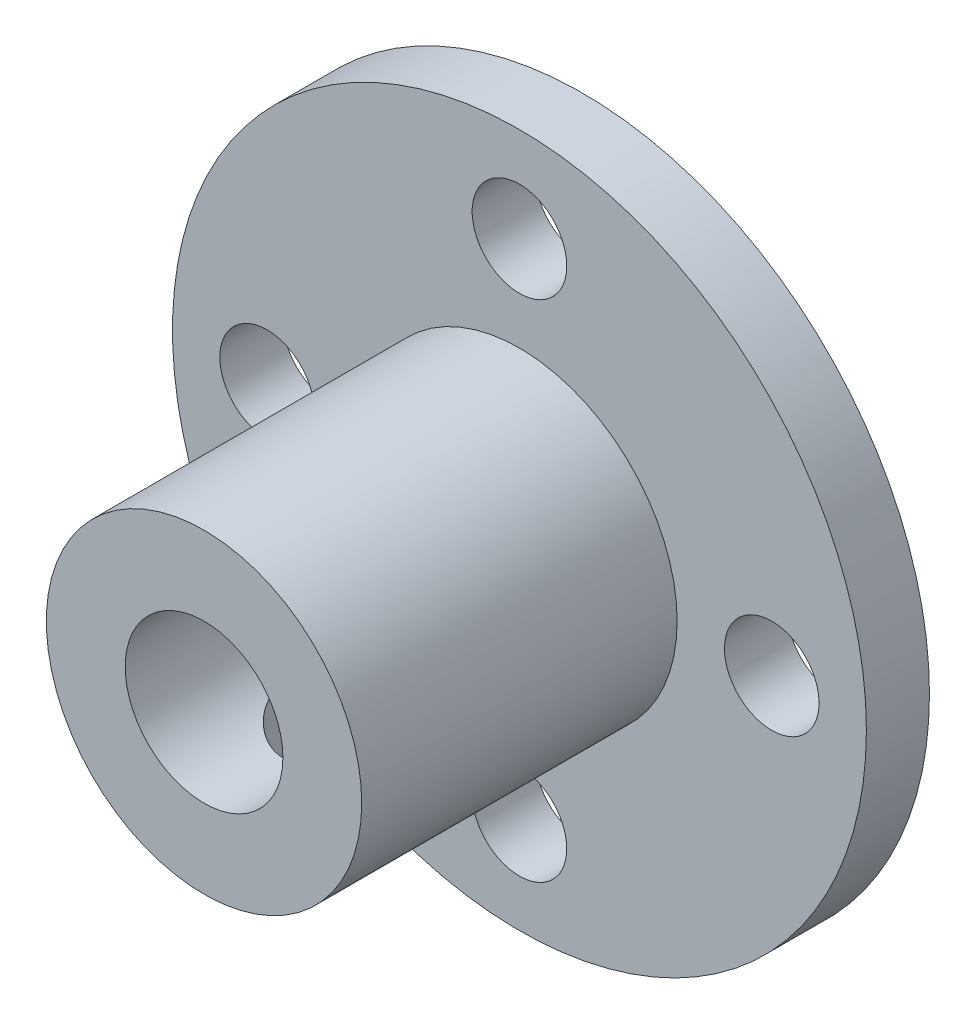
ISO-10303-21;
HEADER;
FILE_DESCRIPTION(('STEP AP214'),'2;1');
FILE_NAME('part.step','',(''),(''),'','','');
FILE_SCHEMA(('AUTOMOTIVE_DESIGN { 1 0 10303 214 1 1 1 1 }'));
ENDSEC;
DATA;
#1=APPLICATION_CONTEXT('core data for automotive mechanical design processes');
#2=APPLICATION_PROTOCOL_DEFINITION('international standard','automotive_design',2000,#1);
#3=PRODUCT_CONTEXT('',#1,'mechanical');
#4=PRODUCT('Part','Part','',(#3));
#5=PRODUCT_RELATED_PRODUCT_CATEGORY('part','',(#4));
#6=PRODUCT_DEFINITION_FORMATION('','',#4);
#7=PRODUCT_DEFINITION_CONTEXT('part definition',#1,'design');
#8=PRODUCT_DEFINITION('design','',#6,#7);
#9=PRODUCT_DEFINITION_SHAPE('','',#8);
#10=(LENGTH_UNIT() NAMED_UNIT(*) SI_UNIT(.MILLI.,.METRE.));
#11=(NAMED_UNIT(*) PLANE_ANGLE_UNIT() SI_UNIT($,.RADIAN.));
#12=(NAMED_UNIT(*) SI_UNIT($,.STERADIAN.) SOLID_ANGLE_UNIT());
#13=UNCERTAINTY_MEASURE_WITH_UNIT(LENGTH_MEASURE(1.E-05),#10,'distance_accuracy_value','');
#14=(GEOMETRIC_REPRESENTATION_CONTEXT(3) GLOBAL_UNCERTAINTY_ASSIGNED_CONTEXT((#13)) GLOBAL_UNIT_ASSIGNED_CONTEXT((#10,
#11,#12)) REPRESENTATION_CONTEXT('',''));
#15=CARTESIAN_POINT('',(0.,0.,0.));
#16=DIRECTION('',(0.,0.,1.));
#17=DIRECTION('',(1.,0.,0.));
#18=AXIS2_PLACEMENT_3D('',#15,#16,#17);
#19=CARTESIAN_POINT('',(0.,0.,2.));
#20=DIRECTION('',(0.,0.,-1.));
#21=DIRECTION('',(-1.,0.,0.));
#22=AXIS2_PLACEMENT_3D('',#19,#20,#21);
#23=CYLINDRICAL_SURFACE('',#22,10.999999971);
#24=CARTESIAN_POINT('',(0.,0.,2.));
#25=DIRECTION('',(0.,0.,1.));
#26=DIRECTION('',(1.,0.,0.));
#27=AXIS2_PLACEMENT_3D('',#24,#25,#26);
#28=CIRCLE('',#27,10.999999971);
#29=CARTESIAN_POINT('',(10.999999971,0.,2.));
#30=VERTEX_POINT('',#29);
#31=EDGE_CURVE('E50',#30,#30,#28,.T.);
#32=ORIENTED_EDGE('',*,*,#31,.F.);
#33=EDGE_LOOP('',(#32));
#34=FACE_BOUND('',#33,.T.);
#35=CARTESIAN_POINT('',(0.,0.,0.));
#36=DIRECTION('',(0.,0.,1.));
#37=DIRECTION('',(1.,0.,0.));
#38=AXIS2_PLACEMENT_3D('',#35,#36,#37);
#39=CIRCLE('',#38,10.999999971);
#40=CARTESIAN_POINT('',(10.999999971,0.,0.));
#41=VERTEX_POINT('',#40);
#42=EDGE_CURVE('E56',#41,#41,#39,.T.);
#43=ORIENTED_EDGE('',*,*,#42,.T.);
#44=EDGE_LOOP('',(#43));
#45=FACE_BOUND('',#44,.T.);
#46=ADVANCED_FACE('F37',(#34,#45),#23,.T.);
#47=CARTESIAN_POINT('',(0.,0.,2.));
#48=DIRECTION('',(0.,0.,1.));
#49=DIRECTION('',(1.,0.,0.));
#50=AXIS2_PLACEMENT_3D('',#47,#48,#49);
#51=PLANE('',#50);
#52=CARTESIAN_POINT('',(-8.,0.,2.));
#53=DIRECTION('',(0.,0.,1.));
#54=DIRECTION('',(0.,1.,0.));
#55=AXIS2_PLACEMENT_3D('',#52,#53,#54);
#56=CIRCLE('',#55,1.5);
#57=CARTESIAN_POINT('',(-8.00000000000001,1.49999999999997,2.));
#58=VERTEX_POINT('',#57);
#59=EDGE_CURVE('E130',#58,#58,#56,.T.);
#60=ORIENTED_EDGE('',*,*,#59,.F.);
#61=EDGE_LOOP('',(#60));
#62=FACE_BOUND('',#61,.T.);
#63=CARTESIAN_POINT('',(0.,-8.,2.));
#64=DIRECTION('',(0.,0.,1.));
#65=DIRECTION('',(-1.,0.,0.));
#66=AXIS2_PLACEMENT_3D('',#63,#64,#65);
#67=CIRCLE('',#66,1.5);
#68=CARTESIAN_POINT('',(-1.5,-8.,2.));
#69=VERTEX_POINT('',#68);
#70=EDGE_CURVE('E134',#69,#69,#67,.T.);
#71=ORIENTED_EDGE('',*,*,#70,.F.);
#72=EDGE_LOOP('',(#71));
#73=FACE_BOUND('',#72,.T.);
#74=CARTESIAN_POINT('',(8.,0.,2.));
#75=DIRECTION('',(0.,0.,1.));
#76=DIRECTION('',(0.,-1.,0.));
#77=AXIS2_PLACEMENT_3D('',#74,#75,#76);
#78=CIRCLE('',#77,1.5);
#79=CARTESIAN_POINT('',(8.00000000000002,-1.49999999999992,2.));
#80=VERTEX_POINT('',#79);
#81=EDGE_CURVE('E138',#80,#80,#78,.T.);
#82=ORIENTED_EDGE('',*,*,#81,.F.);
#83=EDGE_LOOP('',(#82));
#84=FACE_BOUND('',#83,.T.);
#85=CARTESIAN_POINT('',(0.,8.,2.));
#86=DIRECTION('',(0.,0.,1.));
#87=DIRECTION('',(1.,0.,0.));
#88=AXIS2_PLACEMENT_3D('',#85,#86,#87);
#89=CIRCLE('',#88,1.5);
#90=CARTESIAN_POINT('',(1.5,8.,2.));
#91=VERTEX_POINT('',#90);
#92=EDGE_CURVE('E87',#91,#91,#89,.T.);
#93=ORIENTED_EDGE('',*,*,#92,.F.);
#94=EDGE_LOOP('',(#93));
#95=FACE_BOUND('',#94,.T.);
#96=CARTESIAN_POINT('',(0.,0.,2.));
#97=DIRECTION('',(0.,0.,1.));
#98=DIRECTION('',(1.,0.,0.));
#99=AXIS2_PLACEMENT_3D('',#96,#97,#98);
#100=CIRCLE('',#99,5.);
#101=CARTESIAN_POINT('',(5.,0.,2.));
#102=VERTEX_POINT('',#101);
#103=EDGE_CURVE('E10',#102,#102,#100,.T.);
#104=ORIENTED_EDGE('',*,*,#103,.F.);
#105=EDGE_LOOP('',(#104));
#106=FACE_BOUND('',#105,.T.);
#107=ORIENTED_EDGE('',*,*,#31,.T.);
#108=EDGE_LOOP('',(#107));
#109=FACE_BOUND('',#108,.T.);
#110=ADVANCED_FACE('F115',(#62,#73,#84,#95,#106,#109),#51,.T.);
#111=CARTESIAN_POINT('',(0.,0.,0.));
#112=DIRECTION('',(0.,0.,1.));
#113=DIRECTION('',(1.,0.,0.));
#114=AXIS2_PLACEMENT_3D('',#111,#112,#113);
#115=PLANE('',#114);
#116=CARTESIAN_POINT('',(-8.,0.,0.));
#117=DIRECTION('',(0.,0.,1.));
#118=DIRECTION('',(0.,1.,0.));
#119=AXIS2_PLACEMENT_3D('',#116,#117,#118);
#120=CIRCLE('',#119,1.5);
#121=CARTESIAN_POINT('',(-8.00000000000001,1.49999999999997,0.));
#122=VERTEX_POINT('',#121);
#123=EDGE_CURVE('E145',#122,#122,#120,.T.);
#124=ORIENTED_EDGE('',*,*,#123,.T.);
#125=EDGE_LOOP('',(#124));
#126=FACE_BOUND('',#125,.T.);
#127=CARTESIAN_POINT('',(0.,-8.,0.));
#128=DIRECTION('',(0.,0.,1.));
#129=DIRECTION('',(-1.,0.,0.));
#130=AXIS2_PLACEMENT_3D('',#127,#128,#129);
#131=CIRCLE('',#130,1.5);
#132=CARTESIAN_POINT('',(-1.5,-8.,0.));
#133=VERTEX_POINT('',#132);
#134=EDGE_CURVE('E153',#133,#133,#131,.T.);
#135=ORIENTED_EDGE('',*,*,#134,.T.);
#136=EDGE_LOOP('',(#135));
#137=FACE_BOUND('',#136,.T.);
#138=CARTESIAN_POINT('',(8.,0.,0.));
#139=DIRECTION('',(0.,0.,1.));
#140=DIRECTION('',(0.,-1.,0.));
#141=AXIS2_PLACEMENT_3D('',#138,#139,#140);
#142=CIRCLE('',#141,1.5);
#143=CARTESIAN_POINT('',(8.00000000000002,-1.49999999999992,0.));
#144=VERTEX_POINT('',#143);
#145=EDGE_CURVE('E161',#144,#144,#142,.T.);
#146=ORIENTED_EDGE('',*,*,#145,.T.);
#147=EDGE_LOOP('',(#146));
#148=FACE_BOUND('',#147,.T.);
#149=CARTESIAN_POINT('',(0.,8.,0.));
#150=DIRECTION('',(0.,0.,1.));
#151=DIRECTION('',(1.,0.,0.));
#152=AXIS2_PLACEMENT_3D('',#149,#150,#151);
#153=CIRCLE('',#152,1.5);
#154=CARTESIAN_POINT('',(1.5,8.,0.));
#155=VERTEX_POINT('',#154);
#156=EDGE_CURVE('E144',#155,#155,#153,.T.);
#157=ORIENTED_EDGE('',*,*,#156,.T.);
#158=EDGE_LOOP('',(#157));
#159=FACE_BOUND('',#158,.T.);
#160=CARTESIAN_POINT('',(0.,0.,0.));
#161=DIRECTION('',(0.,0.,1.));
#162=DIRECTION('',(1.,0.,0.));
#163=AXIS2_PLACEMENT_3D('',#160,#161,#162);
#164=CIRCLE('',#163,2.5);
#165=CARTESIAN_POINT('',(2.5,0.,0.));
#166=VERTEX_POINT('',#165);
#167=EDGE_CURVE('E67',#166,#166,#164,.T.);
#168=ORIENTED_EDGE('',*,*,#167,.T.);
#169=EDGE_LOOP('',(#168));
#170=FACE_BOUND('',#169,.T.);
#171=ORIENTED_EDGE('',*,*,#42,.F.);
#172=EDGE_LOOP('',(#171));
#173=FACE_BOUND('',#172,.T.);
#174=ADVANCED_FACE('F111',(#126,#137,#148,#159,#170,#173),#115,.F.);
#175=CARTESIAN_POINT('',(0.,0.,12.));
#176=DIRECTION('',(0.,0.,-1.));
#177=DIRECTION('',(-1.,0.,0.));
#178=AXIS2_PLACEMENT_3D('',#175,#176,#177);
#179=CYLINDRICAL_SURFACE('',#178,5.);
#180=CARTESIAN_POINT('',(0.,-5.,9.500000048));
#181=CARTESIAN_POINT('',(0.0822886152646513,-4.99999929250568,9.49999905051541));
#182=CARTESIAN_POINT('',(0.164587323371197,-4.99794915681454,9.49320618417885));
#183=CARTESIAN_POINT('',(0.326788135260431,-4.98997105532517,9.46627869280292));
#184=CARTESIAN_POINT('',(0.406689516794646,-4.98404193292377,9.44614008842198));
#185=CARTESIAN_POINT('',(0.561732724840896,-4.96895552312414,9.39325402802341));
#186=CARTESIAN_POINT('',(0.636881383757677,-4.95980300005085,9.36052517438401));
#187=CARTESIAN_POINT('',(0.780624204778959,-4.93922108865979,9.28346394876697));
#188=CARTESIAN_POINT('',(0.849217493282935,-4.92779139749987,9.23913003317771));
#189=CARTESIAN_POINT('',(0.979871827097542,-4.90350736598068,9.13877603020398));
#190=CARTESIAN_POINT('',(1.04171810315282,-4.89062382979733,9.08248341012042));
#191=CARTESIAN_POINT('',(1.15524924483818,-4.86505833367351,8.9603908024554));
#192=CARTESIAN_POINT('',(1.20693240058095,-4.85237640798219,8.89458921827003));
#193=CARTESIAN_POINT('',(1.29980041772821,-4.82834112905556,8.75352927298468));
#194=CARTESIAN_POINT('',(1.34072313216917,-4.81702405497373,8.67809156260994));
#195=CARTESIAN_POINT('',(1.40921399216941,-4.79743619090203,8.52101076427648));
#196=CARTESIAN_POINT('',(1.43678534464076,-4.78916466950431,8.43936917190667));
#197=CARTESIAN_POINT('',(1.47701638376501,-4.77690869387457,8.27460974440115));
#198=CARTESIAN_POINT('',(1.49007200979935,-4.77281067843102,8.19159726404741));
#199=CARTESIAN_POINT('',(1.5021373541843,-4.76902788236738,8.02446684639405));
#200=CARTESIAN_POINT('',(1.50115047571964,-4.76934203246384,7.94034918187147));
#201=CARTESIAN_POINT('',(1.48546981983149,-4.77424742579499,7.77661608631004));
#202=CARTESIAN_POINT('',(1.47127210016375,-4.7786838713581,7.69694774221944));
#203=CARTESIAN_POINT('',(1.43037425088823,-4.79108354837097,7.54118020172328));
#204=CARTESIAN_POINT('',(1.40367288741123,-4.79904712787684,7.46508135837433));
#205=CARTESIAN_POINT('',(1.3381603109518,-4.81772731841971,7.31739963164531));
#206=CARTESIAN_POINT('',(1.299188212792,-4.8284801494817,7.24589289516201));
#207=CARTESIAN_POINT('',(1.21035226709552,-4.85150985973182,7.11026795290897));
#208=CARTESIAN_POINT('',(1.16048577996687,-4.86378710795792,7.04615154349618));
#209=CARTESIAN_POINT('',(1.04881294457145,-4.8891101050812,6.92431377808754));
#210=CARTESIAN_POINT('',(0.986594942585505,-4.90216653606592,6.86697130280354));
#211=CARTESIAN_POINT('',(0.853263290514089,-4.92712243525804,6.76344597905515));
#212=CARTESIAN_POINT('',(0.782149080939959,-4.93902183061495,6.71726383300762));
#213=CARTESIAN_POINT('',(0.63235506282191,-4.96043159761108,6.63714003588867));
#214=CARTESIAN_POINT('',(0.553627771740589,-4.96992543427675,6.60328244074472));
#215=CARTESIAN_POINT('',(0.391245432392717,-4.98533521704775,6.54940036462757));
#216=CARTESIAN_POINT('',(0.307591765661963,-4.99125216105033,6.52937202528577));
#217=CARTESIAN_POINT('',(0.14095225144631,-4.99868364622916,6.50434777464606));
#218=CARTESIAN_POINT('',(0.0580501038112236,-5.00034850414865,6.49883836633319));
#219=CARTESIAN_POINT('',(-0.107499604783979,-4.99952923248269,6.50156910744473));
#220=CARTESIAN_POINT('',(-0.190147198254065,-4.99704565676011,6.50980742139241));
#221=CARTESIAN_POINT('',(-0.350903611830611,-4.98830696945108,6.53938456325231));
#222=CARTESIAN_POINT('',(-0.429072781495656,-4.98213829726506,6.56042334008173));
#223=CARTESIAN_POINT('',(-0.580754652459246,-4.96674347687219,6.61464318633042));
#224=CARTESIAN_POINT('',(-0.654266792792947,-4.95751696116221,6.64782571528147));
#225=CARTESIAN_POINT('',(-0.796437209731239,-4.93669654027803,6.72625312147077));
#226=CARTESIAN_POINT('',(-0.864943848700237,-4.92505280437476,6.77175929801058));
#227=CARTESIAN_POINT('',(-0.993523334743792,-4.90073468224724,6.87322471357502));
#228=CARTESIAN_POINT('',(-1.05359406115209,-4.88806003812764,6.92918657279675));
#229=CARTESIAN_POINT('',(-1.16585747835014,-4.86253171084486,7.05238727254909));
#230=CARTESIAN_POINT('',(-1.21768484713221,-4.84968824160968,7.11996184186945));
#231=CARTESIAN_POINT('',(-1.30928998915114,-4.82576514197749,7.26312790927144));
#232=CARTESIAN_POINT('',(-1.34906807835937,-4.81468546533171,7.33871919705841));
#233=CARTESIAN_POINT('',(-1.41517351422234,-4.79567188348753,7.49553246855015));
#234=CARTESIAN_POINT('',(-1.4415635135669,-4.78772336513555,7.5767261663869));
#235=CARTESIAN_POINT('',(-1.48021735437643,-4.775915929306,7.74268795410007));
#236=CARTESIAN_POINT('',(-1.49248603679678,-4.77205561038134,7.82745480871953));
#237=CARTESIAN_POINT('',(-1.50221989289019,-4.76899970982909,7.9943615115949));
#238=CARTESIAN_POINT('',(-1.50028060142943,-4.76961645922064,8.07646364675308));
#239=CARTESIAN_POINT('',(-1.48307510300776,-4.77499399780055,8.239114104153));
#240=CARTESIAN_POINT('',(-1.46780942971702,-4.77975462104273,8.31966248848445));
#241=CARTESIAN_POINT('',(-1.42476893598795,-4.79275762245195,8.47594540728262));
#242=CARTESIAN_POINT('',(-1.39715180260871,-4.80095603163032,8.55172729781214));
#243=CARTESIAN_POINT('',(-1.3303151176203,-4.81990277628716,8.69764245379016));
#244=CARTESIAN_POINT('',(-1.29109334531715,-4.83065159974152,8.76777463482443));
#245=CARTESIAN_POINT('',(-1.20048768188265,-4.8539767534289,8.90316313821599));
#246=CARTESIAN_POINT('',(-1.14871280359268,-4.86660539158555,8.96814878522276));
#247=CARTESIAN_POINT('',(-1.03517438628822,-4.89201319605568,9.08870252660736));
#248=CARTESIAN_POINT('',(-0.973408255621595,-4.90479240062533,9.14426816983083));
#249=CARTESIAN_POINT('',(-0.839465797133501,-4.92950935978267,9.24602344672238));
#250=CARTESIAN_POINT('',(-0.76703791867597,-4.94141159258809,9.29189148324812));
#251=CARTESIAN_POINT('',(-0.61514140240123,-4.96260680107148,9.37073520985262));
#252=CARTESIAN_POINT('',(-0.535676079013649,-4.97190099655077,9.40371692981326));
#253=CARTESIAN_POINT('',(-0.380757732464092,-4.98602174823477,9.45289532022835));
#254=CARTESIAN_POINT('',(-0.305786977916258,-4.99122027289313,9.4705117187373));
#255=CARTESIAN_POINT('',(-0.153880203306795,-4.99820944475635,9.49406357280748));
#256=CARTESIAN_POINT('',(-0.0769445138950142,-5.00000066154724,9.50000098070456));
#257=CARTESIAN_POINT('',(0.,-5.,9.500000048));
#258=B_SPLINE_CURVE_WITH_KNOTS('',3,(#180,#181,#182,#183,#184,#185,#186,#187,#188,#189,#190,
#191,#192,#193,#194,#195,#196,#197,#198,#199,#200,#201,#202,#203,#204,#205,#206,#207,#208,#209,
#210,#211,#212,#213,#214,#215,#216,#217,#218,#219,#220,#221,#222,#223,#224,#225,#226,#227,#228,
#229,#230,#231,#232,#233,#234,#235,#236,#237,#238,#239,#240,#241,#242,#243,#244,#245,#246,#247,
#248,#249,#250,#251,#252,#253,#254,#255,#256,#257),.UNSPECIFIED.,.T.,.F.,(4,2,2,2,2,2,2,2,2,2,2,
2,2,2,2,2,2,2,2,2,2,2,2,2,2,2,2,2,2,2,2,2,2,2,2,2,2,2,4),(0.,0.246583211131695,
0.493239979872933,0.739533698811067,0.98586019441183,1.23855606753251,1.49129441899304,
1.74971486480526,2.00807320884729,2.25919696497441,2.51025986258634,2.75226025342805,
2.99428453008922,3.23962436530433,3.48502370974767,3.74067115697028,3.99633469012841,
4.25371060222256,4.51101467727455,4.75908824410732,5.00712869295716,5.24956763141441,
5.49203571766721,5.74011323630007,5.98825300681975,6.24540419848414,6.50254864622243,
6.75847836174514,7.01432031536237,7.25950178291326,7.50467343234265,7.74680064675078,
7.98897422525519,8.23996951427785,8.49103001421146,8.74943023542082,9.0077093984344,
9.2383172138852,9.46888647616018),.UNSPECIFIED.);
#259=CARTESIAN_POINT('',(0.,-5.,9.500000048));
#260=VERTEX_POINT('',#259);
#261=EDGE_CURVE('E78',#260,#260,#258,.T.);
#262=ORIENTED_EDGE('',*,*,#261,.T.);
#263=EDGE_LOOP('',(#262));
#264=FACE_BOUND('',#263,.T.);
#265=CARTESIAN_POINT('',(0.,0.,12.));
#266=DIRECTION('',(0.,0.,1.));
#267=DIRECTION('',(1.,0.,0.));
#268=AXIS2_PLACEMENT_3D('',#265,#266,#267);
#269=CIRCLE('',#268,5.);
#270=CARTESIAN_POINT('',(5.,0.,12.));
#271=VERTEX_POINT('',#270);
#272=EDGE_CURVE('E59',#271,#271,#269,.T.);
#273=ORIENTED_EDGE('',*,*,#272,.F.);
#274=EDGE_LOOP('',(#273));
#275=FACE_BOUND('',#274,.T.);
#276=ORIENTED_EDGE('',*,*,#103,.T.);
#277=EDGE_LOOP('',(#276));
#278=FACE_BOUND('',#277,.T.);
#279=ADVANCED_FACE('F89',(#264,#275,#278),#179,.T.);
#280=CARTESIAN_POINT('',(0.,0.,12.));
#281=DIRECTION('',(0.,0.,1.));
#282=DIRECTION('',(1.,0.,0.));
#283=AXIS2_PLACEMENT_3D('',#280,#281,#282);
#284=PLANE('',#283);
#285=CARTESIAN_POINT('',(0.,0.,12.));
#286=DIRECTION('',(0.,0.,1.));
#287=DIRECTION('',(1.,0.,0.));
#288=AXIS2_PLACEMENT_3D('',#285,#286,#287);
#289=CIRCLE('',#288,2.5);
#290=CARTESIAN_POINT('',(2.5,0.,12.));
#291=VERTEX_POINT('',#290);
#292=EDGE_CURVE('E72',#291,#291,#289,.T.);
#293=ORIENTED_EDGE('',*,*,#292,.F.);
#294=EDGE_LOOP('',(#293));
#295=FACE_BOUND('',#294,.T.);
#296=ORIENTED_EDGE('',*,*,#272,.T.);
#297=EDGE_LOOP('',(#296));
#298=FACE_BOUND('',#297,.T.);
#299=ADVANCED_FACE('F104',(#295,#298),#284,.T.);
#300=CARTESIAN_POINT('',(0.,0.,0.));
#301=DIRECTION('',(0.,0.,1.));
#302=DIRECTION('',(1.,0.,0.));
#303=AXIS2_PLACEMENT_3D('',#300,#301,#302);
#304=CYLINDRICAL_SURFACE('',#303,2.5);
#305=CARTESIAN_POINT('',(0.,-2.5,9.500000048));
#306=CARTESIAN_POINT('',(-0.0767298355240368,-2.49999625789592,9.49999595698864));
#307=CARTESIAN_POINT('',(-0.153582324747805,-2.49642904595925,9.49407137694572));
#308=CARTESIAN_POINT('',(-0.30497551762311,-2.48249903515327,9.47067572786782));
#309=CARTESIAN_POINT('',(-0.379510044636526,-2.47211947884453,9.45317618517072));
#310=CARTESIAN_POINT('',(-0.523751841584813,-2.44561557764976,9.40761368495424));
#311=CARTESIAN_POINT('',(-0.593481043826685,-2.4295197289737,9.37960308741332));
#312=CARTESIAN_POINT('',(-0.727030337288505,-2.39295367052523,9.31413971119926));
#313=CARTESIAN_POINT('',(-0.790851890157214,-2.37248454694079,9.27668927667898));
#314=CARTESIAN_POINT('',(-0.916299303222659,-2.32705359771931,9.19022521527344));
#315=CARTESIAN_POINT('',(-0.977384046089592,-2.30186791097644,9.14054634562432));
#316=CARTESIAN_POINT('',(-1.09088273353134,-2.25030437859955,9.03253283497931));
#317=CARTESIAN_POINT('',(-1.14328538051232,-2.22392503563707,8.97418710045783));
#318=CARTESIAN_POINT('',(-1.24445000241835,-2.169110650084,8.84207652390133));
#319=CARTESIAN_POINT('',(-1.29197770059574,-2.14082015488467,8.7672982612258));
#320=CARTESIAN_POINT('',(-1.37361441811459,-2.08938298758058,8.60915345413849));
#321=CARTESIAN_POINT('',(-1.40774521545757,-2.06622799408604,8.52580112850078));
#322=CARTESIAN_POINT('',(-1.45440606134472,-2.03354626501036,8.37340357021213));
#323=CARTESIAN_POINT('',(-1.47016201738714,-2.02207879872481,8.30576402117918));
#324=CARTESIAN_POINT('',(-1.49216176974748,-2.00590304848904,8.16819630162707));
#325=CARTESIAN_POINT('',(-1.49841739261976,-2.00118636120769,8.09827108744728));
#326=CARTESIAN_POINT('',(-1.50105513636855,-1.99920918829324,7.95798851927849));
#327=CARTESIAN_POINT('',(-1.49741788313643,-2.00196333343456,7.88763058695189));
#328=CARTESIAN_POINT('',(-1.4804606550267,-2.01453257751474,7.74872123363436));
#329=CARTESIAN_POINT('',(-1.46713339698137,-2.02435298751746,7.68017121168211));
#330=CARTESIAN_POINT('',(-1.4317392707071,-2.0495318331904,7.54746976280478));
#331=CARTESIAN_POINT('',(-1.409787539179,-2.064817080664,7.48327294992027));
#332=CARTESIAN_POINT('',(-1.35795067152313,-2.09927047869352,7.35930501067165));
#333=CARTESIAN_POINT('',(-1.3280626270796,-2.11844005207574,7.29953551701892));
#334=CARTESIAN_POINT('',(-1.2551798875015,-2.16255324038953,7.17501590014317));
#335=CARTESIAN_POINT('',(-1.21080730006407,-2.18792040269902,7.11122190232758));
#336=CARTESIAN_POINT('',(-1.11291098466982,-2.23930596940815,6.99132350755158));
#337=CARTESIAN_POINT('',(-1.05937850814666,-2.26532497591194,6.93522655516204));
#338=CARTESIAN_POINT('',(-0.935811890940725,-2.31935502681495,6.82438700173774));
#339=CARTESIAN_POINT('',(-0.864517738165326,-2.34713834232954,6.77092267420071));
#340=CARTESIAN_POINT('',(-0.712276103067818,-2.39772426878247,6.67687792650859));
#341=CARTESIAN_POINT('',(-0.63133381479773,-2.42052954108342,6.63629061675017));
#342=CARTESIAN_POINT('',(-0.467197631547881,-2.4573039119575,6.57206778172234));
#343=CARTESIAN_POINT('',(-0.38446766763948,-2.47173956775222,6.54752460600446));
#344=CARTESIAN_POINT('',(-0.21504793233378,-2.49218842503926,6.51298875934774));
#345=CARTESIAN_POINT('',(-0.12836303938891,-2.4982117279225,6.50297863682713));
#346=CARTESIAN_POINT('',(0.0337145866573076,-2.50090570419066,6.49849210362829));
#347=CARTESIAN_POINT('',(0.109042448185385,-2.49873521832014,6.50209109488916));
#348=CARTESIAN_POINT('',(0.257829381917742,-2.48778712302617,6.52042580078973));
#349=CARTESIAN_POINT('',(0.331288491986099,-2.47900964758196,6.53516128959902));
#350=CARTESIAN_POINT('',(0.472574919358608,-2.45594792693812,6.57454337797866));
#351=CARTESIAN_POINT('',(0.540495740080716,-2.44180275908152,6.59894029342139));
#352=CARTESIAN_POINT('',(0.671265742209223,-2.40913881060037,6.656677319249));
#353=CARTESIAN_POINT('',(0.734113920104506,-2.39061916741331,6.69001919358429));
#354=CARTESIAN_POINT('',(0.860006262176033,-2.34845496267813,6.76855692019415));
#355=CARTESIAN_POINT('',(0.922394152013867,-2.32447802684839,6.81462376946289));
#356=CARTESIAN_POINT('',(1.03902603734523,-2.27474265305993,6.91539133279113));
#357=CARTESIAN_POINT('',(1.09326041104589,-2.24898216189369,6.97010209367402));
#358=CARTESIAN_POINT('',(1.19931998124082,-2.19445423161978,7.09491032866678));
#359=CARTESIAN_POINT('',(1.24991021339262,-2.1657324077007,7.1660838245065));
#360=CARTESIAN_POINT('',(1.33845241264063,-2.11216180588378,7.31721596487264));
#361=CARTESIAN_POINT('',(1.37641769438081,-2.08730896245695,7.39716523505097));
#362=CARTESIAN_POINT('',(1.43142582040252,-2.04984906979737,7.54624296569639));
#363=CARTESIAN_POINT('',(1.45121628835121,-2.03575656837474,7.61398025700664));
#364=CARTESIAN_POINT('',(1.48113667902829,-2.01409602807367,7.75253202577876));
#365=CARTESIAN_POINT('',(1.49127999538126,-2.00651894491971,7.82334209381747));
#366=CARTESIAN_POINT('',(1.50134135119808,-1.99900443084989,7.96637690133313));
#367=CARTESIAN_POINT('',(1.50122094028624,-1.99909572749912,8.03860594688225));
#368=CARTESIAN_POINT('',(1.49066478271207,-2.00697713946759,8.18189439710728));
#369=CARTESIAN_POINT('',(1.48022342701269,-2.01477144107373,8.25295314442225));
#370=CARTESIAN_POINT('',(1.45040179962319,-2.03633181100649,8.38848838600195));
#371=CARTESIAN_POINT('',(1.43147642836367,-2.04979207619614,8.45311706404529));
#372=CARTESIAN_POINT('',(1.38563248421773,-2.0810549773349,8.57833722703785));
#373=CARTESIAN_POINT('',(1.35871090109406,-2.09885924816781,8.63892718104077));
#374=CARTESIAN_POINT('',(1.29289252466712,-2.14012986372549,8.76431983456593));
#375=CARTESIAN_POINT('',(1.25279174803604,-2.16404583452557,8.82834108299885));
#376=CARTESIAN_POINT('',(1.16375705956257,-2.21320123048162,8.94938005572084));
#377=CARTESIAN_POINT('',(1.11481587397405,-2.23844173321652,9.00639194741586));
#378=CARTESIAN_POINT('',(1.00009785554834,-2.29225686744329,9.12135094100757));
#379=CARTESIAN_POINT('',(0.932876901521191,-2.32070305360159,9.17793107106683));
#380=CARTESIAN_POINT('',(0.788462517859709,-2.37365426102816,9.27909786087676));
#381=CARTESIAN_POINT('',(0.711265528204316,-2.39815786831633,9.32368022154438));
#382=CARTESIAN_POINT('',(0.5511253124557,-2.43985576818916,9.39778582713439));
#383=CARTESIAN_POINT('',(0.468430166128387,-2.45725075983136,9.42772808964424));
#384=CARTESIAN_POINT('',(0.297973379109731,-2.48366272137654,9.47272472958174));
#385=CARTESIAN_POINT('',(0.210232168946209,-2.49271125302173,9.48783520672475));
#386=CARTESIAN_POINT('',(0.10155815123691,-2.49802000956241,9.49669749927761));
#387=CARTESIAN_POINT('',(0.0812763025287929,-2.49876114523712,9.49793446315974));
#388=CARTESIAN_POINT('',(0.0406658424773323,-2.49975164490735,9.49958629394053));
#389=CARTESIAN_POINT('',(0.0203372295363485,-2.50000099184404,9.50000113232185));
#390=CARTESIAN_POINT('',(0.,-2.5,9.500000048));
#391=B_SPLINE_CURVE_WITH_KNOTS('',3,(#305,#306,#307,#308,#309,#310,#311,#312,#313,#314,#315,
#316,#317,#318,#319,#320,#321,#322,#323,#324,#325,#326,#327,#328,#329,#330,#331,#332,#333,#334,
#335,#336,#337,#338,#339,#340,#341,#342,#343,#344,#345,#346,#347,#348,#349,#350,#351,#352,#353,
#354,#355,#356,#357,#358,#359,#360,#361,#362,#363,#364,#365,#366,#367,#368,#369,#370,#371,#372,
#373,#374,#375,#376,#377,#378,#379,#380,#381,#382,#383,#384,#385,#386,#387,#388,#389,#390),
.UNSPECIFIED.,.T.,.F.,(4,2,2,2,2,2,2,2,2,2,2,2,2,2,2,2,2,2,2,2,2,2,2,2,2,2,2,2,2,2,2,2,2,2,2,2,
2,2,2,2,2,2,4),(0.,0.230102243689637,0.460772639723546,0.690308902834054,0.919788222280092,
1.1668159387493,1.41416261793083,1.69183818090164,1.96906046631138,2.17933836203927,
2.38935427671,2.59978178041578,2.81036760862335,3.01823275449117,3.22617417933096,
3.47047003860997,3.71500053954163,3.99360968072858,4.2720695050303,4.53296803050406,
4.79355300392788,5.01875616910843,5.24395476765034,5.46367801051937,5.6834446148129,
5.92601382121821,6.1688670686667,6.44336780050886,6.71757811083037,6.93257806481605,
7.14727908596192,7.36278446367448,7.57840702471014,7.78364119842077,7.98895273229875,
8.22578631912066,8.46281566383608,8.73854334604291,9.01436969681056,9.28175679502218,
9.54812858612912,9.60911503030589,9.67010358990314),.UNSPECIFIED.);
#392=CARTESIAN_POINT('',(0.,-2.5,9.500000048));
#393=VERTEX_POINT('',#392);
#394=EDGE_CURVE('E40',#393,#393,#391,.T.);
#395=ORIENTED_EDGE('',*,*,#394,.T.);
#396=EDGE_LOOP('',(#395));
#397=FACE_BOUND('',#396,.T.);
#398=ORIENTED_EDGE('',*,*,#167,.F.);
#399=EDGE_LOOP('',(#398));
#400=FACE_BOUND('',#399,.T.);
#401=ORIENTED_EDGE('',*,*,#292,.T.);
#402=EDGE_LOOP('',(#401));
#403=FACE_BOUND('',#402,.T.);
#404=ADVANCED_FACE('F98',(#397,#400,#403),#304,.F.);
#405=CARTESIAN_POINT('',(0.,-10.,8.));
#406=DIRECTION('',(0.,1.,0.));
#407=DIRECTION('',(0.,0.,1.));
#408=AXIS2_PLACEMENT_3D('',#405,#406,#407);
#409=CYLINDRICAL_SURFACE('',#408,1.500000048);
#410=ORIENTED_EDGE('',*,*,#394,.F.);
#411=EDGE_LOOP('',(#410));
#412=FACE_BOUND('',#411,.T.);
#413=ORIENTED_EDGE('',*,*,#261,.F.);
#414=EDGE_LOOP('',(#413));
#415=FACE_BOUND('',#414,.T.);
#416=ADVANCED_FACE('F93',(#412,#415),#409,.F.);
#417=CARTESIAN_POINT('',(0.,8.,0.));
#418=DIRECTION('',(0.,0.,1.));
#419=DIRECTION('',(1.,0.,0.));
#420=AXIS2_PLACEMENT_3D('',#417,#418,#419);
#421=CYLINDRICAL_SURFACE('',#420,1.5);
#422=ORIENTED_EDGE('',*,*,#156,.F.);
#423=EDGE_LOOP('',(#422));
#424=FACE_BOUND('',#423,.T.);
#425=ORIENTED_EDGE('',*,*,#92,.T.);
#426=EDGE_LOOP('',(#425));
#427=FACE_BOUND('',#426,.T.);
#428=ADVANCED_FACE('F97',(#424,#427),#421,.F.);
#429=CARTESIAN_POINT('',(8.,0.,0.));
#430=DIRECTION('',(0.,0.,1.));
#431=DIRECTION('',(1.,0.,0.));
#432=AXIS2_PLACEMENT_3D('',#429,#430,#431);
#433=CYLINDRICAL_SURFACE('',#432,1.5);
#434=ORIENTED_EDGE('',*,*,#145,.F.);
#435=EDGE_LOOP('',(#434));
#436=FACE_BOUND('',#435,.T.);
#437=ORIENTED_EDGE('',*,*,#81,.T.);
#438=EDGE_LOOP('',(#437));
#439=FACE_BOUND('',#438,.T.);
#440=ADVANCED_FACE('F167',(#436,#439),#433,.F.);
#441=CARTESIAN_POINT('',(0.,-8.,0.));
#442=DIRECTION('',(0.,0.,1.));
#443=DIRECTION('',(1.,0.,0.));
#444=AXIS2_PLACEMENT_3D('',#441,#442,#443);
#445=CYLINDRICAL_SURFACE('',#444,1.5);
#446=ORIENTED_EDGE('',*,*,#134,.F.);
#447=EDGE_LOOP('',(#446));
#448=FACE_BOUND('',#447,.T.);
#449=ORIENTED_EDGE('',*,*,#70,.T.);
#450=EDGE_LOOP('',(#449));
#451=FACE_BOUND('',#450,.T.);
#452=ADVANCED_FACE('F169',(#448,#451),#445,.F.);
#453=CARTESIAN_POINT('',(-8.,0.,0.));
#454=DIRECTION('',(0.,0.,1.));
#455=DIRECTION('',(1.,0.,0.));
#456=AXIS2_PLACEMENT_3D('',#453,#454,#455);
#457=CYLINDRICAL_SURFACE('',#456,1.5);
#458=ORIENTED_EDGE('',*,*,#123,.F.);
#459=EDGE_LOOP('',(#458));
#460=FACE_BOUND('',#459,.T.);
#461=ORIENTED_EDGE('',*,*,#59,.T.);
#462=EDGE_LOOP('',(#461));
#463=FACE_BOUND('',#462,.T.);
#464=ADVANCED_FACE('F175',(#460,#463),#457,.F.);
#465=CLOSED_SHELL('',(#46,#110,#174,#279,#299,#404,#416,#428,#440,#452,#464));
#466=MANIFOLD_SOLID_BREP('B2',#465);
#467=ADVANCED_BREP_SHAPE_REPRESENTATION('',(#18,#466),#14);
#468=SHAPE_DEFINITION_REPRESENTATION(#9,#467);
ENDSEC;
END-ISO-10303-21;
